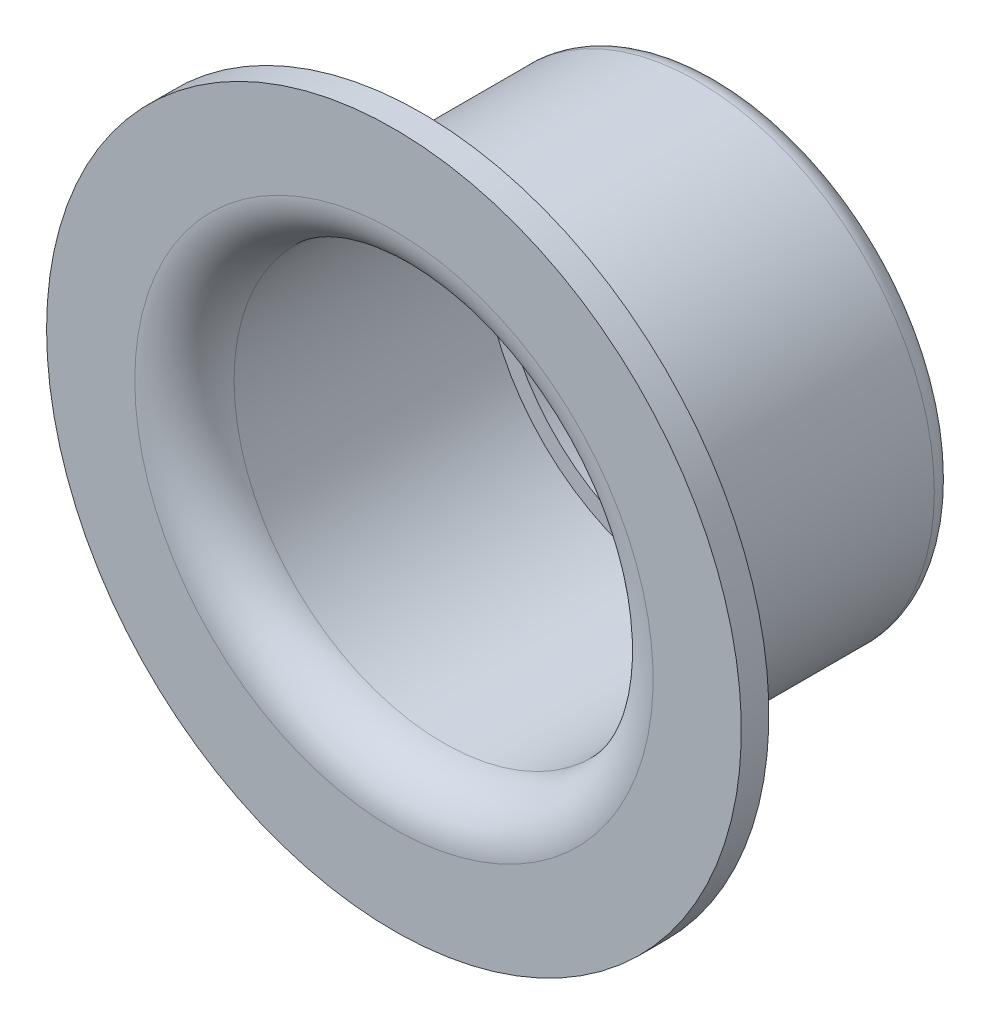
ISO-10303-21;
HEADER;
FILE_DESCRIPTION(('STEP AP214'),'2;1');
FILE_NAME('part.step','',(''),(''),'','','');
FILE_SCHEMA(('AUTOMOTIVE_DESIGN { 1 0 10303 214 1 1 1 1 }'));
ENDSEC;
DATA;
#1=APPLICATION_CONTEXT('core data for automotive mechanical design processes');
#2=APPLICATION_PROTOCOL_DEFINITION('international standard','automotive_design',2000,#1);
#3=PRODUCT_CONTEXT('',#1,'mechanical');
#4=PRODUCT('Part','Part','',(#3));
#5=PRODUCT_RELATED_PRODUCT_CATEGORY('part','',(#4));
#6=PRODUCT_DEFINITION_FORMATION('','',#4);
#7=PRODUCT_DEFINITION_CONTEXT('part definition',#1,'design');
#8=PRODUCT_DEFINITION('design','',#6,#7);
#9=PRODUCT_DEFINITION_SHAPE('','',#8);
#10=(LENGTH_UNIT() NAMED_UNIT(*) SI_UNIT(.MILLI.,.METRE.));
#11=(NAMED_UNIT(*) PLANE_ANGLE_UNIT() SI_UNIT($,.RADIAN.));
#12=(NAMED_UNIT(*) SI_UNIT($,.STERADIAN.) SOLID_ANGLE_UNIT());
#13=UNCERTAINTY_MEASURE_WITH_UNIT(LENGTH_MEASURE(1.E-05),#10,'distance_accuracy_value','');
#14=(GEOMETRIC_REPRESENTATION_CONTEXT(3) GLOBAL_UNCERTAINTY_ASSIGNED_CONTEXT((#13)) GLOBAL_UNIT_ASSIGNED_CONTEXT((#10,
#11,#12)) REPRESENTATION_CONTEXT('',''));
#15=CARTESIAN_POINT('',(0.,0.,0.));
#16=DIRECTION('',(0.,0.,1.));
#17=DIRECTION('',(1.,0.,0.));
#18=AXIS2_PLACEMENT_3D('',#15,#16,#17);
#19=CARTESIAN_POINT('',(0.,0.,0.));
#20=DIRECTION('',(0.,0.,-1.));
#21=DIRECTION('',(-1.,0.,0.));
#22=AXIS2_PLACEMENT_3D('',#19,#20,#21);
#23=CYLINDRICAL_SURFACE('',#22,17.4625);
#24=CARTESIAN_POINT('',(0.,0.,0.));
#25=DIRECTION('',(0.,0.,-1.));
#26=DIRECTION('',(-1.,0.,0.));
#27=AXIS2_PLACEMENT_3D('',#24,#25,#26);
#28=CIRCLE('',#27,17.4625);
#29=CARTESIAN_POINT('',(-17.4625,0.,0.));
#30=VERTEX_POINT('',#29);
#31=EDGE_CURVE('E81',#30,#30,#28,.T.);
#32=ORIENTED_EDGE('',*,*,#31,.T.);
#33=EDGE_LOOP('',(#32));
#34=FACE_BOUND('',#33,.T.);
#35=CARTESIAN_POINT('',(0.,0.,2.5));
#36=DIRECTION('',(0.,0.,-1.));
#37=DIRECTION('',(-1.,0.,0.));
#38=AXIS2_PLACEMENT_3D('',#35,#36,#37);
#39=CIRCLE('',#38,17.4625);
#40=CARTESIAN_POINT('',(-17.4625,0.,2.5));
#41=VERTEX_POINT('',#40);
#42=EDGE_CURVE('E12',#41,#41,#39,.T.);
#43=ORIENTED_EDGE('',*,*,#42,.F.);
#44=EDGE_LOOP('',(#43));
#45=FACE_BOUND('',#44,.T.);
#46=ADVANCED_FACE('F44',(#34,#45),#23,.F.);
#47=CARTESIAN_POINT('',(0.,17.4625,2.5));
#48=DIRECTION('',(0.,0.,1.));
#49=DIRECTION('',(1.,0.,0.));
#50=AXIS2_PLACEMENT_3D('',#47,#48,#49);
#51=PLANE('',#50);
#52=ORIENTED_EDGE('',*,*,#42,.T.);
#53=EDGE_LOOP('',(#52));
#54=FACE_BOUND('',#53,.T.);
#55=CARTESIAN_POINT('',(0.,0.,2.5));
#56=DIRECTION('',(0.,0.,-1.));
#57=DIRECTION('',(-1.,0.,0.));
#58=AXIS2_PLACEMENT_3D('',#55,#56,#57);
#59=CIRCLE('',#58,19.);
#60=CARTESIAN_POINT('',(-19.,0.,2.5));
#61=VERTEX_POINT('',#60);
#62=EDGE_CURVE('E50',#61,#61,#59,.T.);
#63=ORIENTED_EDGE('',*,*,#62,.F.);
#64=EDGE_LOOP('',(#63));
#65=FACE_BOUND('',#64,.T.);
#66=ADVANCED_FACE('F99',(#54,#65),#51,.T.);
#67=CARTESIAN_POINT('',(0.,0.,0.));
#68=DIRECTION('',(0.,0.,-1.));
#69=DIRECTION('',(-1.,0.,0.));
#70=AXIS2_PLACEMENT_3D('',#67,#68,#69);
#71=CYLINDRICAL_SURFACE('',#70,19.);
#72=ORIENTED_EDGE('',*,*,#62,.T.);
#73=EDGE_LOOP('',(#72));
#74=FACE_BOUND('',#73,.T.);
#75=CARTESIAN_POINT('',(0.,0.,25.));
#76=DIRECTION('',(0.,0.,-1.));
#77=DIRECTION('',(-1.,0.,0.));
#78=AXIS2_PLACEMENT_3D('',#75,#76,#77);
#79=CIRCLE('',#78,19.);
#80=CARTESIAN_POINT('',(-19.,0.,25.));
#81=VERTEX_POINT('',#80);
#82=EDGE_CURVE('E54',#81,#81,#79,.T.);
#83=ORIENTED_EDGE('',*,*,#82,.F.);
#84=EDGE_LOOP('',(#83));
#85=FACE_BOUND('',#84,.T.);
#86=ADVANCED_FACE('F103',(#74,#85),#71,.F.);
#87=CARTESIAN_POINT('',(0.,0.,25.));
#88=DIRECTION('',(0.,0.,-1.));
#89=DIRECTION('',(-1.,0.,0.));
#90=AXIS2_PLACEMENT_3D('',#87,#88,#89);
#91=TOROIDAL_SURFACE('',#90,23.5,4.5);
#92=ORIENTED_EDGE('',*,*,#82,.T.);
#93=EDGE_LOOP('',(#92));
#94=FACE_BOUND('',#93,.T.);
#95=CARTESIAN_POINT('',(0.,0.,29.5));
#96=DIRECTION('',(0.,0.,-1.));
#97=DIRECTION('',(-1.,0.,0.));
#98=AXIS2_PLACEMENT_3D('',#95,#96,#97);
#99=CIRCLE('',#98,23.5);
#100=CARTESIAN_POINT('',(-23.5,0.,29.5));
#101=VERTEX_POINT('',#100);
#102=EDGE_CURVE('E58',#101,#101,#99,.T.);
#103=ORIENTED_EDGE('',*,*,#102,.F.);
#104=EDGE_LOOP('',(#103));
#105=FACE_BOUND('',#104,.T.);
#106=ADVANCED_FACE('F107',(#94,#105),#91,.T.);
#107=CARTESIAN_POINT('',(0.,23.5,29.5));
#108=DIRECTION('',(0.,0.,1.));
#109=DIRECTION('',(1.,0.,0.));
#110=AXIS2_PLACEMENT_3D('',#107,#108,#109);
#111=PLANE('',#110);
#112=ORIENTED_EDGE('',*,*,#102,.T.);
#113=EDGE_LOOP('',(#112));
#114=FACE_BOUND('',#113,.T.);
#115=CARTESIAN_POINT('',(0.,0.,29.5));
#116=DIRECTION('',(0.,0.,-1.));
#117=DIRECTION('',(-1.,0.,0.));
#118=AXIS2_PLACEMENT_3D('',#115,#116,#117);
#119=CIRCLE('',#118,31.5);
#120=CARTESIAN_POINT('',(-31.5,0.,29.5));
#121=VERTEX_POINT('',#120);
#122=EDGE_CURVE('E63',#121,#121,#119,.T.);
#123=ORIENTED_EDGE('',*,*,#122,.F.);
#124=EDGE_LOOP('',(#123));
#125=FACE_BOUND('',#124,.T.);
#126=ADVANCED_FACE('F113',(#114,#125),#111,.T.);
#127=CARTESIAN_POINT('',(0.,0.,0.));
#128=DIRECTION('',(0.,0.,-1.));
#129=DIRECTION('',(-1.,0.,0.));
#130=AXIS2_PLACEMENT_3D('',#127,#128,#129);
#131=CYLINDRICAL_SURFACE('',#130,31.5);
#132=ORIENTED_EDGE('',*,*,#122,.T.);
#133=EDGE_LOOP('',(#132));
#134=FACE_BOUND('',#133,.T.);
#135=CARTESIAN_POINT('',(0.,0.,27.));
#136=DIRECTION('',(0.,0.,-1.));
#137=DIRECTION('',(-1.,0.,0.));
#138=AXIS2_PLACEMENT_3D('',#135,#136,#137);
#139=CIRCLE('',#138,31.5);
#140=CARTESIAN_POINT('',(-31.5,0.,27.));
#141=VERTEX_POINT('',#140);
#142=EDGE_CURVE('E66',#141,#141,#139,.T.);
#143=ORIENTED_EDGE('',*,*,#142,.F.);
#144=EDGE_LOOP('',(#143));
#145=FACE_BOUND('',#144,.T.);
#146=ADVANCED_FACE('F117',(#134,#145),#131,.T.);
#147=CARTESIAN_POINT('',(0.,23.5,27.));
#148=DIRECTION('',(0.,0.,-1.));
#149=DIRECTION('',(-1.,0.,0.));
#150=AXIS2_PLACEMENT_3D('',#147,#148,#149);
#151=PLANE('',#150);
#152=ORIENTED_EDGE('',*,*,#142,.T.);
#153=EDGE_LOOP('',(#152));
#154=FACE_BOUND('',#153,.T.);
#155=CARTESIAN_POINT('',(0.,0.,27.));
#156=DIRECTION('',(0.,0.,-1.));
#157=DIRECTION('',(-1.,0.,0.));
#158=AXIS2_PLACEMENT_3D('',#155,#156,#157);
#159=CIRCLE('',#158,23.5);
#160=CARTESIAN_POINT('',(-23.5,0.,27.));
#161=VERTEX_POINT('',#160);
#162=EDGE_CURVE('E69',#161,#161,#159,.T.);
#163=ORIENTED_EDGE('',*,*,#162,.F.);
#164=EDGE_LOOP('',(#163));
#165=FACE_BOUND('',#164,.T.);
#166=ADVANCED_FACE('F121',(#154,#165),#151,.T.);
#167=CARTESIAN_POINT('',(0.,0.,25.));
#168=DIRECTION('',(0.,0.,-1.));
#169=DIRECTION('',(-1.,0.,0.));
#170=AXIS2_PLACEMENT_3D('',#167,#168,#169);
#171=TOROIDAL_SURFACE('',#170,23.5,2.);
#172=ORIENTED_EDGE('',*,*,#162,.T.);
#173=EDGE_LOOP('',(#172));
#174=FACE_BOUND('',#173,.T.);
#175=CARTESIAN_POINT('',(0.,0.,25.));
#176=DIRECTION('',(0.,0.,-1.));
#177=DIRECTION('',(-1.,0.,0.));
#178=AXIS2_PLACEMENT_3D('',#175,#176,#177);
#179=CIRCLE('',#178,21.5);
#180=CARTESIAN_POINT('',(-21.5,0.,25.));
#181=VERTEX_POINT('',#180);
#182=EDGE_CURVE('E72',#181,#181,#179,.T.);
#183=ORIENTED_EDGE('',*,*,#182,.F.);
#184=EDGE_LOOP('',(#183));
#185=FACE_BOUND('',#184,.T.);
#186=ADVANCED_FACE('F125',(#174,#185),#171,.F.);
#187=CARTESIAN_POINT('',(0.,0.,0.));
#188=DIRECTION('',(0.,0.,-1.));
#189=DIRECTION('',(-1.,0.,0.));
#190=AXIS2_PLACEMENT_3D('',#187,#188,#189);
#191=CYLINDRICAL_SURFACE('',#190,21.5);
#192=ORIENTED_EDGE('',*,*,#182,.T.);
#193=EDGE_LOOP('',(#192));
#194=FACE_BOUND('',#193,.T.);
#195=CARTESIAN_POINT('',(0.,0.,2.));
#196=DIRECTION('',(0.,0.,-1.));
#197=DIRECTION('',(-1.,0.,0.));
#198=AXIS2_PLACEMENT_3D('',#195,#196,#197);
#199=CIRCLE('',#198,21.5);
#200=CARTESIAN_POINT('',(-21.5,0.,2.));
#201=VERTEX_POINT('',#200);
#202=EDGE_CURVE('E75',#201,#201,#199,.T.);
#203=ORIENTED_EDGE('',*,*,#202,.F.);
#204=EDGE_LOOP('',(#203));
#205=FACE_BOUND('',#204,.T.);
#206=ADVANCED_FACE('F95',(#194,#205),#191,.T.);
#207=CARTESIAN_POINT('',(0.,0.,2.));
#208=DIRECTION('',(0.,0.,-1.));
#209=DIRECTION('',(-1.,0.,0.));
#210=AXIS2_PLACEMENT_3D('',#207,#208,#209);
#211=TOROIDAL_SURFACE('',#210,19.5,2.);
#212=ORIENTED_EDGE('',*,*,#202,.T.);
#213=EDGE_LOOP('',(#212));
#214=FACE_BOUND('',#213,.T.);
#215=CARTESIAN_POINT('',(0.,0.,0.));
#216=DIRECTION('',(0.,0.,-1.));
#217=DIRECTION('',(-1.,0.,0.));
#218=AXIS2_PLACEMENT_3D('',#215,#216,#217);
#219=CIRCLE('',#218,19.5);
#220=CARTESIAN_POINT('',(-19.5,0.,0.));
#221=VERTEX_POINT('',#220);
#222=EDGE_CURVE('E78',#221,#221,#219,.T.);
#223=ORIENTED_EDGE('',*,*,#222,.F.);
#224=EDGE_LOOP('',(#223));
#225=FACE_BOUND('',#224,.T.);
#226=ADVANCED_FACE('F89',(#214,#225),#211,.T.);
#227=CARTESIAN_POINT('',(0.,17.4625,0.));
#228=DIRECTION('',(0.,0.,-1.));
#229=DIRECTION('',(-1.,0.,0.));
#230=AXIS2_PLACEMENT_3D('',#227,#228,#229);
#231=PLANE('',#230);
#232=ORIENTED_EDGE('',*,*,#222,.T.);
#233=EDGE_LOOP('',(#232));
#234=FACE_BOUND('',#233,.T.);
#235=ORIENTED_EDGE('',*,*,#31,.F.);
#236=EDGE_LOOP('',(#235));
#237=FACE_BOUND('',#236,.T.);
#238=ADVANCED_FACE('F87',(#234,#237),#231,.T.);
#239=CLOSED_SHELL('',(#46,#66,#86,#106,#126,#146,#166,#186,#206,#226,#238));
#240=MANIFOLD_SOLID_BREP('B2',#239);
#241=ADVANCED_BREP_SHAPE_REPRESENTATION('',(#18,#240),#14);
#242=SHAPE_DEFINITION_REPRESENTATION(#9,#241);
ENDSEC;
END-ISO-10303-21;
